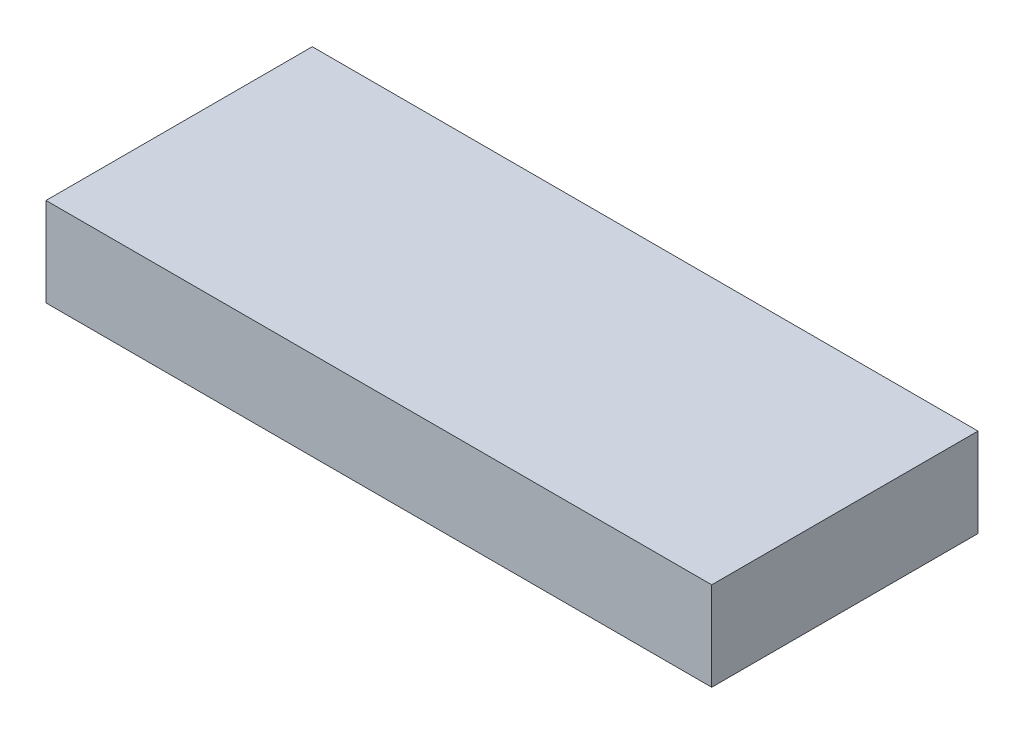
ISO-10303-21;
HEADER;
FILE_DESCRIPTION(('STEP AP214'),'2;1');
FILE_NAME('part.step','',(''),(''),'','','');
FILE_SCHEMA(('AUTOMOTIVE_DESIGN { 1 0 10303 214 1 1 1 1 }'));
ENDSEC;
DATA;
#1=APPLICATION_CONTEXT('core data for automotive mechanical design processes');
#2=APPLICATION_PROTOCOL_DEFINITION('international standard','automotive_design',2000,#1);
#3=PRODUCT_CONTEXT('',#1,'mechanical');
#4=PRODUCT('Part','Part','',(#3));
#5=PRODUCT_RELATED_PRODUCT_CATEGORY('part','',(#4));
#6=PRODUCT_DEFINITION_FORMATION('','',#4);
#7=PRODUCT_DEFINITION_CONTEXT('part definition',#1,'design');
#8=PRODUCT_DEFINITION('design','',#6,#7);
#9=PRODUCT_DEFINITION_SHAPE('','',#8);
#10=(LENGTH_UNIT() NAMED_UNIT(*) SI_UNIT(.MILLI.,.METRE.));
#11=(NAMED_UNIT(*) PLANE_ANGLE_UNIT() SI_UNIT($,.RADIAN.));
#12=(NAMED_UNIT(*) SI_UNIT($,.STERADIAN.) SOLID_ANGLE_UNIT());
#13=UNCERTAINTY_MEASURE_WITH_UNIT(LENGTH_MEASURE(1.E-05),#10,'distance_accuracy_value','');
#14=(GEOMETRIC_REPRESENTATION_CONTEXT(3) GLOBAL_UNCERTAINTY_ASSIGNED_CONTEXT((#13)) GLOBAL_UNIT_ASSIGNED_CONTEXT((#10,
#11,#12)) REPRESENTATION_CONTEXT('',''));
#15=CARTESIAN_POINT('',(0.,0.,0.));
#16=DIRECTION('',(0.,0.,1.));
#17=DIRECTION('',(1.,0.,0.));
#18=AXIS2_PLACEMENT_3D('',#15,#16,#17);
#19=CARTESIAN_POINT('',(7.50000000000001,-1.,6.));
#20=DIRECTION('',(-1.,0.,0.));
#21=DIRECTION('',(0.,0.,1.));
#22=AXIS2_PLACEMENT_3D('',#19,#20,#21);
#23=PLANE('',#22);
#24=DIRECTION('',(0.,1.,0.));
#25=VECTOR('',#24,1.);
#26=CARTESIAN_POINT('',(7.50000000000001,-1.,0.));
#27=LINE('',#26,#25);
#28=CARTESIAN_POINT('',(7.50000000000001,-1.,0.));
#29=VERTEX_POINT('',#28);
#30=CARTESIAN_POINT('',(7.50000000000001,1.,0.));
#31=VERTEX_POINT('',#30);
#32=EDGE_CURVE('E107',#29,#31,#27,.T.);
#33=ORIENTED_EDGE('',*,*,#32,.T.);
#34=DIRECTION('',(0.,0.,-1.));
#35=VECTOR('',#34,1.);
#36=CARTESIAN_POINT('',(7.50000000000001,1.,6.));
#37=LINE('',#36,#35);
#38=CARTESIAN_POINT('',(7.50000000000001,1.,6.));
#39=VERTEX_POINT('',#38);
#40=EDGE_CURVE('E11',#39,#31,#37,.T.);
#41=ORIENTED_EDGE('',*,*,#40,.F.);
#42=DIRECTION('',(0.,1.,0.));
#43=VECTOR('',#42,1.);
#44=CARTESIAN_POINT('',(7.50000000000001,-1.,6.));
#45=LINE('',#44,#43);
#46=CARTESIAN_POINT('',(7.50000000000001,-1.,6.));
#47=VERTEX_POINT('',#46);
#48=EDGE_CURVE('E91',#47,#39,#45,.T.);
#49=ORIENTED_EDGE('',*,*,#48,.F.);
#50=DIRECTION('',(0.,0.,-1.));
#51=VECTOR('',#50,1.);
#52=CARTESIAN_POINT('',(7.50000000000001,-1.,6.));
#53=LINE('',#52,#51);
#54=EDGE_CURVE('E103',#47,#29,#53,.T.);
#55=ORIENTED_EDGE('',*,*,#54,.T.);
#56=EDGE_LOOP('',(#33,#41,#49,#55));
#57=FACE_BOUND('',#56,.T.);
#58=ADVANCED_FACE('F39',(#57),#23,.F.);
#59=CARTESIAN_POINT('',(-7.49999999999999,1.,6.));
#60=DIRECTION('',(0.,-1.,0.));
#61=DIRECTION('',(0.,0.,-1.));
#62=AXIS2_PLACEMENT_3D('',#59,#60,#61);
#63=PLANE('',#62);
#64=DIRECTION('',(-1.,0.,0.));
#65=VECTOR('',#64,1.);
#66=CARTESIAN_POINT('',(-7.49999999999999,1.,0.));
#67=LINE('',#66,#65);
#68=CARTESIAN_POINT('',(-7.49999999999999,1.,0.));
#69=VERTEX_POINT('',#68);
#70=EDGE_CURVE('E96',#31,#69,#67,.T.);
#71=ORIENTED_EDGE('',*,*,#70,.T.);
#72=DIRECTION('',(0.,0.,-1.));
#73=VECTOR('',#72,1.);
#74=CARTESIAN_POINT('',(-7.49999999999999,1.,6.));
#75=LINE('',#74,#73);
#76=CARTESIAN_POINT('',(-7.49999999999999,1.,6.));
#77=VERTEX_POINT('',#76);
#78=EDGE_CURVE('E48',#77,#69,#75,.T.);
#79=ORIENTED_EDGE('',*,*,#78,.F.);
#80=DIRECTION('',(-1.,0.,0.));
#81=VECTOR('',#80,1.);
#82=CARTESIAN_POINT('',(-7.49999999999999,1.,6.));
#83=LINE('',#82,#81);
#84=EDGE_CURVE('E86',#39,#77,#83,.T.);
#85=ORIENTED_EDGE('',*,*,#84,.F.);
#86=ORIENTED_EDGE('',*,*,#40,.T.);
#87=EDGE_LOOP('',(#71,#79,#85,#86));
#88=FACE_BOUND('',#87,.T.);
#89=ADVANCED_FACE('F95',(#88),#63,.F.);
#90=CARTESIAN_POINT('',(-7.49999999999999,-1.,6.));
#91=DIRECTION('',(1.,0.,0.));
#92=DIRECTION('',(0.,0.,-1.));
#93=AXIS2_PLACEMENT_3D('',#90,#91,#92);
#94=PLANE('',#93);
#95=DIRECTION('',(0.,-1.,0.));
#96=VECTOR('',#95,1.);
#97=CARTESIAN_POINT('',(-7.49999999999999,-1.,0.));
#98=LINE('',#97,#96);
#99=CARTESIAN_POINT('',(-7.49999999999999,-1.,0.));
#100=VERTEX_POINT('',#99);
#101=EDGE_CURVE('E73',#69,#100,#98,.T.);
#102=ORIENTED_EDGE('',*,*,#101,.T.);
#103=DIRECTION('',(0.,0.,-1.));
#104=VECTOR('',#103,1.);
#105=CARTESIAN_POINT('',(-7.49999999999999,-1.,6.));
#106=LINE('',#105,#104);
#107=CARTESIAN_POINT('',(-7.49999999999999,-1.,6.));
#108=VERTEX_POINT('',#107);
#109=EDGE_CURVE('E98',#108,#100,#106,.T.);
#110=ORIENTED_EDGE('',*,*,#109,.F.);
#111=DIRECTION('',(0.,-1.,0.));
#112=VECTOR('',#111,1.);
#113=CARTESIAN_POINT('',(-7.49999999999999,-1.,6.));
#114=LINE('',#113,#112);
#115=EDGE_CURVE('E89',#77,#108,#114,.T.);
#116=ORIENTED_EDGE('',*,*,#115,.F.);
#117=ORIENTED_EDGE('',*,*,#78,.T.);
#118=EDGE_LOOP('',(#102,#110,#116,#117));
#119=FACE_BOUND('',#118,.T.);
#120=ADVANCED_FACE('F99',(#119),#94,.F.);
#121=CARTESIAN_POINT('',(-7.49999999999999,-1.,6.));
#122=DIRECTION('',(0.,1.,0.));
#123=DIRECTION('',(0.,0.,1.));
#124=AXIS2_PLACEMENT_3D('',#121,#122,#123);
#125=PLANE('',#124);
#126=DIRECTION('',(1.,0.,0.));
#127=VECTOR('',#126,1.);
#128=CARTESIAN_POINT('',(-7.49999999999999,-1.,0.));
#129=LINE('',#128,#127);
#130=EDGE_CURVE('E79',#100,#29,#129,.T.);
#131=ORIENTED_EDGE('',*,*,#130,.T.);
#132=ORIENTED_EDGE('',*,*,#54,.F.);
#133=DIRECTION('',(1.,0.,0.));
#134=VECTOR('',#133,1.);
#135=CARTESIAN_POINT('',(-7.49999999999999,-1.,6.));
#136=LINE('',#135,#134);
#137=EDGE_CURVE('E56',#108,#47,#136,.T.);
#138=ORIENTED_EDGE('',*,*,#137,.F.);
#139=ORIENTED_EDGE('',*,*,#109,.T.);
#140=EDGE_LOOP('',(#131,#132,#138,#139));
#141=FACE_BOUND('',#140,.T.);
#142=ADVANCED_FACE('F120',(#141),#125,.F.);
#143=CARTESIAN_POINT('',(0.,0.,6.));
#144=DIRECTION('',(0.,0.,-1.));
#145=DIRECTION('',(-1.,0.,0.));
#146=AXIS2_PLACEMENT_3D('',#143,#144,#145);
#147=PLANE('',#146);
#148=ORIENTED_EDGE('',*,*,#48,.T.);
#149=ORIENTED_EDGE('',*,*,#84,.T.);
#150=ORIENTED_EDGE('',*,*,#115,.T.);
#151=ORIENTED_EDGE('',*,*,#137,.T.);
#152=EDGE_LOOP('',(#148,#149,#150,#151));
#153=FACE_BOUND('',#152,.T.);
#154=ADVANCED_FACE('F87',(#153),#147,.F.);
#155=CARTESIAN_POINT('',(0.,0.,0.));
#156=DIRECTION('',(0.,0.,-1.));
#157=DIRECTION('',(-1.,0.,0.));
#158=AXIS2_PLACEMENT_3D('',#155,#156,#157);
#159=PLANE('',#158);
#160=ORIENTED_EDGE('',*,*,#32,.F.);
#161=ORIENTED_EDGE('',*,*,#130,.F.);
#162=ORIENTED_EDGE('',*,*,#101,.F.);
#163=ORIENTED_EDGE('',*,*,#70,.F.);
#164=EDGE_LOOP('',(#160,#161,#162,#163));
#165=FACE_BOUND('',#164,.T.);
#166=ADVANCED_FACE('F123',(#165),#159,.T.);
#167=CLOSED_SHELL('',(#58,#89,#120,#142,#154,#166));
#168=MANIFOLD_SOLID_BREP('B2',#167);
#169=ADVANCED_BREP_SHAPE_REPRESENTATION('',(#18,#168),#14);
#170=SHAPE_DEFINITION_REPRESENTATION(#9,#169);
ENDSEC;
END-ISO-10303-21;
